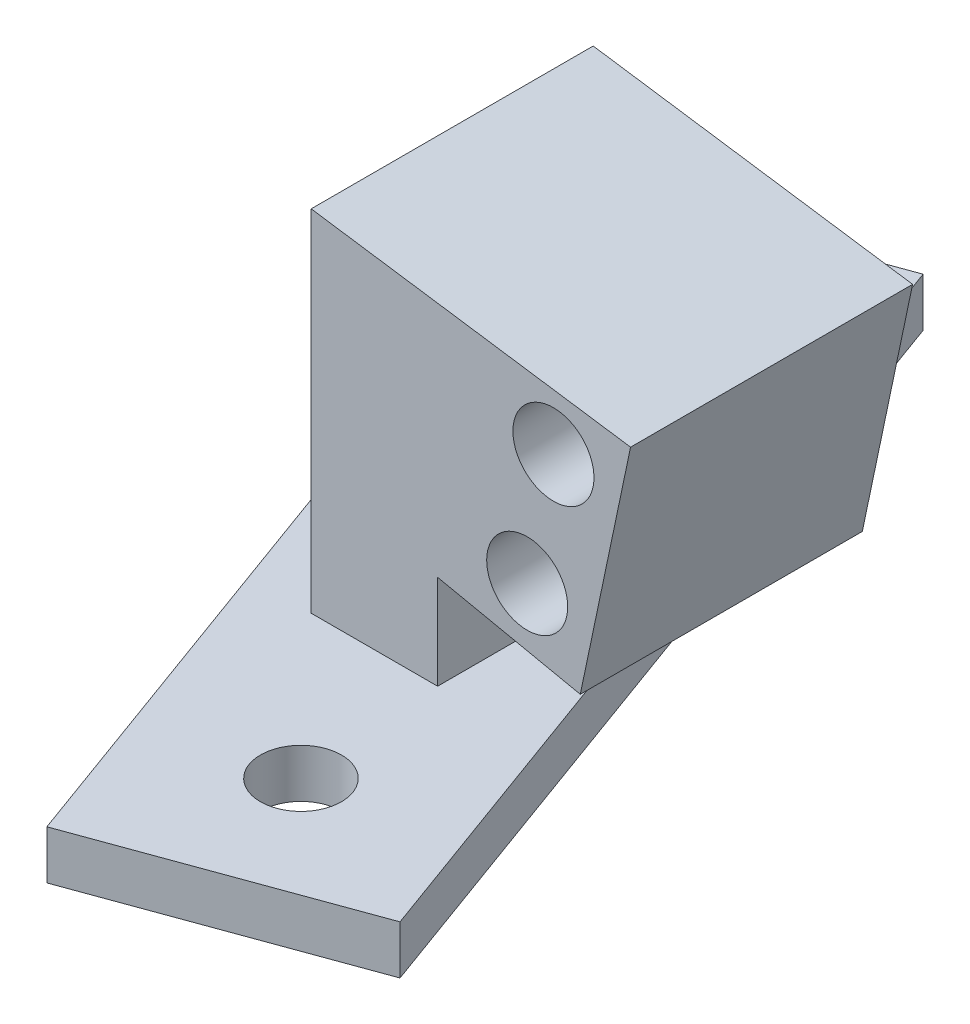
ISO-10303-21;
HEADER;
FILE_DESCRIPTION(('STEP AP214'),'2;1');
FILE_NAME('part.step','',(''),(''),'','','');
FILE_SCHEMA(('AUTOMOTIVE_DESIGN { 1 0 10303 214 1 1 1 1 }'));
ENDSEC;
DATA;
#1=APPLICATION_CONTEXT('core data for automotive mechanical design processes');
#2=APPLICATION_PROTOCOL_DEFINITION('international standard','automotive_design',2000,#1);
#3=PRODUCT_CONTEXT('',#1,'mechanical');
#4=PRODUCT('Part','Part','',(#3));
#5=PRODUCT_RELATED_PRODUCT_CATEGORY('part','',(#4));
#6=PRODUCT_DEFINITION_FORMATION('','',#4);
#7=PRODUCT_DEFINITION_CONTEXT('part definition',#1,'design');
#8=PRODUCT_DEFINITION('design','',#6,#7);
#9=PRODUCT_DEFINITION_SHAPE('','',#8);
#10=(LENGTH_UNIT() NAMED_UNIT(*) SI_UNIT(.MILLI.,.METRE.));
#11=(NAMED_UNIT(*) PLANE_ANGLE_UNIT() SI_UNIT($,.RADIAN.));
#12=(NAMED_UNIT(*) SI_UNIT($,.STERADIAN.) SOLID_ANGLE_UNIT());
#13=UNCERTAINTY_MEASURE_WITH_UNIT(LENGTH_MEASURE(1.E-05),#10,'distance_accuracy_value','');
#14=(GEOMETRIC_REPRESENTATION_CONTEXT(3) GLOBAL_UNCERTAINTY_ASSIGNED_CONTEXT((#13)) GLOBAL_UNIT_ASSIGNED_CONTEXT((#10,
#11,#12)) REPRESENTATION_CONTEXT('',''));
#15=CARTESIAN_POINT('',(0.,0.,0.));
#16=DIRECTION('',(0.,0.,1.));
#17=DIRECTION('',(1.,0.,0.));
#18=AXIS2_PLACEMENT_3D('',#15,#16,#17);
#19=CARTESIAN_POINT('',(-650.357758597395,213.432549690593,53.0414259923048));
#20=DIRECTION('',(0.205752852606501,0.978603987138969,0.));
#21=DIRECTION('',(-0.978603987138969,0.205752852606501,0.));
#22=AXIS2_PLACEMENT_3D('',#19,#20,#21);
#23=PLANE('',#22);
#24=DIRECTION('',(0.,0.,1.));
#25=VECTOR('',#24,1.);
#26=CARTESIAN_POINT('',(-644.129361835329,212.123020588114,0.));
#27=LINE('',#26,#25);
#28=CARTESIAN_POINT('',(-644.129361835329,212.123020588114,0.));
#29=VERTEX_POINT('',#28);
#30=CARTESIAN_POINT('',(-644.129361835329,212.123020588114,22.098));
#31=VERTEX_POINT('',#30);
#32=EDGE_CURVE('E126',#29,#31,#27,.T.);
#33=ORIENTED_EDGE('',*,*,#32,.F.);
#34=DIRECTION('',(0.978603987138969,-0.205752852606501,0.));
#35=VECTOR('',#34,1.);
#36=CARTESIAN_POINT('',(-650.357758597395,213.432549690593,0.));
#37=LINE('',#36,#35);
#38=CARTESIAN_POINT('',(-632.951817258193,209.772926257714,0.));
#39=VERTEX_POINT('',#38);
#40=EDGE_CURVE('E145',#29,#39,#37,.T.);
#41=ORIENTED_EDGE('',*,*,#40,.T.);
#42=DIRECTION('',(0.,0.,-1.));
#43=VECTOR('',#42,1.);
#44=CARTESIAN_POINT('',(-632.951817258193,209.772926257714,53.0414259923048));
#45=LINE('',#44,#43);
#46=CARTESIAN_POINT('',(-632.951817258193,209.772926257714,22.0979999999998));
#47=VERTEX_POINT('',#46);
#48=EDGE_CURVE('E143',#47,#39,#45,.T.);
#49=ORIENTED_EDGE('',*,*,#48,.F.);
#50=DIRECTION('',(-0.978603987138969,0.205752852606501,0.));
#51=VECTOR('',#50,1.);
#52=CARTESIAN_POINT('',(-650.357758597395,213.432549690593,22.0979999999998));
#53=LINE('',#52,#51);
#54=EDGE_CURVE('E70',#47,#31,#53,.T.);
#55=ORIENTED_EDGE('',*,*,#54,.T.);
#56=EDGE_LOOP('',(#33,#41,#49,#55));
#57=FACE_BOUND('',#56,.T.);
#58=ADVANCED_FACE('F45',(#57),#23,.F.);
#59=CARTESIAN_POINT('',(0.,0.,0.));
#60=DIRECTION('',(0.,0.,1.));
#61=DIRECTION('',(1.,0.,0.));
#62=AXIS2_PLACEMENT_3D('',#59,#60,#61);
#63=PLANE('',#62);
#64=DIRECTION('',(0.,1.,0.));
#65=VECTOR('',#64,1.);
#66=CARTESIAN_POINT('',(-654.037262265417,232.174381810683,0.));
#67=LINE('',#66,#65);
#68=CARTESIAN_POINT('',(-654.037262265417,204.732760244927,0.));
#69=VERTEX_POINT('',#68);
#70=CARTESIAN_POINT('',(-654.037262265417,232.174381810683,0.));
#71=VERTEX_POINT('',#70);
#72=EDGE_CURVE('E230',#69,#71,#67,.T.);
#73=ORIENTED_EDGE('',*,*,#72,.T.);
#74=DIRECTION('',(-0.989476406877661,0.144694299239717,0.));
#75=VECTOR('',#74,1.);
#76=CARTESIAN_POINT('',(-629.011320926215,228.514758377805,0.));
#77=LINE('',#76,#75);
#78=CARTESIAN_POINT('',(-629.011320926215,228.514758377805,0.));
#79=VERTEX_POINT('',#78);
#80=EDGE_CURVE('E251',#79,#71,#77,.T.);
#81=ORIENTED_EDGE('',*,*,#80,.F.);
#82=DIRECTION('',(0.205752852606502,0.978603987138969,0.));
#83=VECTOR('',#82,1.);
#84=CARTESIAN_POINT('',(-632.951817258193,209.772926257714,0.));
#85=LINE('',#84,#83);
#86=EDGE_CURVE('E151',#39,#79,#85,.T.);
#87=ORIENTED_EDGE('',*,*,#86,.F.);
#88=ORIENTED_EDGE('',*,*,#40,.F.);
#89=DIRECTION('',(0.,-1.,0.));
#90=VECTOR('',#89,1.);
#91=CARTESIAN_POINT('',(-644.129361835329,212.123020588114,0.));
#92=LINE('',#91,#90);
#93=CARTESIAN_POINT('',(-644.129361835329,204.732760244927,0.));
#94=VERTEX_POINT('',#93);
#95=EDGE_CURVE('E130',#29,#94,#92,.T.);
#96=ORIENTED_EDGE('',*,*,#95,.T.);
#97=DIRECTION('',(-1.,0.,0.));
#98=VECTOR('',#97,1.);
#99=CARTESIAN_POINT('',(-1.62308136655196E-13,204.732760244928,0.));
#100=LINE('',#99,#98);
#101=EDGE_CURVE('E61',#94,#69,#100,.T.);
#102=ORIENTED_EDGE('',*,*,#101,.T.);
#103=EDGE_LOOP('',(#73,#81,#87,#88,#96,#102));
#104=FACE_BOUND('',#103,.T.);
#105=CARTESIAN_POINT('',(-635.053635704384,224.999999999999,0.));
#106=DIRECTION('',(0.,0.,1.));
#107=DIRECTION('',(1.,0.,0.));
#108=AXIS2_PLACEMENT_3D('',#105,#106,#107);
#109=CIRCLE('',#108,3.1750000000002);
#110=CARTESIAN_POINT('',(-638.228635704384,224.999999999999,0.));
#111=VERTEX_POINT('',#110);
#112=EDGE_CURVE('E134',#111,#111,#109,.T.);
#113=ORIENTED_EDGE('',*,*,#112,.T.);
#114=EDGE_LOOP('',(#113));
#115=FACE_BOUND('',#114,.T.);
#116=CARTESIAN_POINT('',(-637.111164230449,215.21396012861,0.));
#117=DIRECTION('',(0.,0.,1.));
#118=DIRECTION('',(1.,0.,0.));
#119=AXIS2_PLACEMENT_3D('',#116,#117,#118);
#120=CIRCLE('',#119,3.17500000000009);
#121=CARTESIAN_POINT('',(-640.286164230449,215.21396012861,0.));
#122=VERTEX_POINT('',#121);
#123=EDGE_CURVE('E157',#122,#122,#120,.T.);
#124=ORIENTED_EDGE('',*,*,#123,.T.);
#125=EDGE_LOOP('',(#124));
#126=FACE_BOUND('',#125,.T.);
#127=ADVANCED_FACE('F258',(#104,#115,#126),#63,.F.);
#128=CARTESIAN_POINT('',(-632.951817258193,209.772926257714,53.0414259923048));
#129=DIRECTION('',(-0.978603987138969,0.205752852606502,0.));
#130=DIRECTION('',(-0.205752852606502,-0.978603987138969,0.));
#131=AXIS2_PLACEMENT_3D('',#128,#129,#130);
#132=PLANE('',#131);
#133=DIRECTION('',(0.,0.,-1.));
#134=VECTOR('',#133,1.);
#135=CARTESIAN_POINT('',(-629.011320926215,228.514758377805,53.0414259923048));
#136=LINE('',#135,#134);
#137=CARTESIAN_POINT('',(-629.011320926215,228.514758377805,22.0979999999998));
#138=VERTEX_POINT('',#137);
#139=EDGE_CURVE('E146',#138,#79,#136,.T.);
#140=ORIENTED_EDGE('',*,*,#139,.F.);
#141=DIRECTION('',(-0.205752852606502,-0.978603987138969,0.));
#142=VECTOR('',#141,1.);
#143=CARTESIAN_POINT('',(-632.951817258193,209.772926257714,22.0979999999998));
#144=LINE('',#143,#142);
#145=EDGE_CURVE('E154',#138,#47,#144,.T.);
#146=ORIENTED_EDGE('',*,*,#145,.T.);
#147=ORIENTED_EDGE('',*,*,#48,.T.);
#148=ORIENTED_EDGE('',*,*,#86,.T.);
#149=EDGE_LOOP('',(#140,#146,#147,#148));
#150=FACE_BOUND('',#149,.T.);
#151=ADVANCED_FACE('F273',(#150),#132,.F.);
#152=CARTESIAN_POINT('',(-635.053635704384,224.999999999999,53.0414259923048));
#153=DIRECTION('',(0.,0.,-1.));
#154=DIRECTION('',(-1.,0.,0.));
#155=AXIS2_PLACEMENT_3D('',#152,#153,#154);
#156=CYLINDRICAL_SURFACE('',#155,3.1750000000002);
#157=CARTESIAN_POINT('',(-635.053635704384,224.999999999999,22.0979999999998));
#158=DIRECTION('',(0.,0.,-1.));
#159=DIRECTION('',(-1.,0.,0.));
#160=AXIS2_PLACEMENT_3D('',#157,#158,#159);
#161=CIRCLE('',#160,3.1750000000002);
#162=CARTESIAN_POINT('',(-638.228635704384,224.999999999999,22.0979999999998));
#163=VERTEX_POINT('',#162);
#164=EDGE_CURVE('E11',#163,#163,#161,.T.);
#165=CARTESIAN_POINT('',(-638.228635704384,224.999999999999,22.0979999999998));
#166=CARTESIAN_POINT('',(-638.228635704384,224.999999999999,21.8678124999998));
#167=CARTESIAN_POINT('',(-638.228635704384,224.999999999999,21.6376249999998));
#168=CARTESIAN_POINT('',(-638.228635704384,224.999999999999,21.1772499999998));
#169=CARTESIAN_POINT('',(-638.228635704384,224.999999999999,20.9470624999998));
#170=CARTESIAN_POINT('',(-638.228635704384,224.999999999999,20.4866874999998));
#171=CARTESIAN_POINT('',(-638.228635704384,224.999999999999,20.2564999999998));
#172=CARTESIAN_POINT('',(-638.228635704384,224.999999999999,19.7961249999998));
#173=CARTESIAN_POINT('',(-638.228635704384,224.999999999999,19.5659374999998));
#174=CARTESIAN_POINT('',(-638.228635704384,224.999999999999,19.1055624999998));
#175=CARTESIAN_POINT('',(-638.228635704384,224.999999999999,18.8753749999998));
#176=CARTESIAN_POINT('',(-638.228635704384,224.999999999999,18.4149999999998));
#177=CARTESIAN_POINT('',(-638.228635704384,224.999999999999,18.1848124999998));
#178=CARTESIAN_POINT('',(-638.228635704384,224.999999999999,17.7244374999998));
#179=CARTESIAN_POINT('',(-638.228635704384,224.999999999999,17.4942499999998));
#180=CARTESIAN_POINT('',(-638.228635704384,224.999999999999,17.0338749999998));
#181=CARTESIAN_POINT('',(-638.228635704384,224.999999999999,16.8036874999998));
#182=CARTESIAN_POINT('',(-638.228635704384,224.999999999999,16.3433124999998));
#183=CARTESIAN_POINT('',(-638.228635704384,224.999999999999,16.1131249999998));
#184=CARTESIAN_POINT('',(-638.228635704384,224.999999999999,15.6527499999998));
#185=CARTESIAN_POINT('',(-638.228635704384,224.999999999999,15.4225624999998));
#186=CARTESIAN_POINT('',(-638.228635704384,224.999999999999,14.9621874999998));
#187=CARTESIAN_POINT('',(-638.228635704384,224.999999999999,14.7319999999998));
#188=CARTESIAN_POINT('',(-638.228635704384,224.999999999999,14.2716249999998));
#189=CARTESIAN_POINT('',(-638.228635704384,224.999999999999,14.0414374999998));
#190=CARTESIAN_POINT('',(-638.228635704384,224.999999999999,13.5810624999998));
#191=CARTESIAN_POINT('',(-638.228635704384,224.999999999999,13.3508749999999));
#192=CARTESIAN_POINT('',(-638.228635704384,224.999999999999,12.8904999999999));
#193=CARTESIAN_POINT('',(-638.228635704384,224.999999999999,12.6603124999999));
#194=CARTESIAN_POINT('',(-638.228635704384,224.999999999999,12.1999374999999));
#195=CARTESIAN_POINT('',(-638.228635704384,224.999999999999,11.9697499999999));
#196=CARTESIAN_POINT('',(-638.228635704384,224.999999999999,11.5093749999999));
#197=CARTESIAN_POINT('',(-638.228635704384,224.999999999999,11.2791874999999));
#198=CARTESIAN_POINT('',(-638.228635704384,224.999999999999,10.8188124999999));
#199=CARTESIAN_POINT('',(-638.228635704384,224.999999999999,10.5886249999999));
#200=CARTESIAN_POINT('',(-638.228635704384,224.999999999999,10.1282499999999));
#201=CARTESIAN_POINT('',(-638.228635704384,224.999999999999,9.89806249999989));
#202=CARTESIAN_POINT('',(-638.228635704384,224.999999999999,9.4376874999999));
#203=CARTESIAN_POINT('',(-638.228635704384,224.999999999999,9.2074999999999));
#204=CARTESIAN_POINT('',(-638.228635704384,224.999999999999,8.74712499999991));
#205=CARTESIAN_POINT('',(-638.228635704384,224.999999999999,8.51693749999991));
#206=CARTESIAN_POINT('',(-638.228635704384,224.999999999999,8.05656249999991));
#207=CARTESIAN_POINT('',(-638.228635704384,224.999999999999,7.82637499999992));
#208=CARTESIAN_POINT('',(-638.228635704384,224.999999999999,7.36599999999992));
#209=CARTESIAN_POINT('',(-638.228635704384,224.999999999999,7.13581249999992));
#210=CARTESIAN_POINT('',(-638.228635704384,224.999999999999,6.67543749999993));
#211=CARTESIAN_POINT('',(-638.228635704384,224.999999999999,6.44524999999993));
#212=CARTESIAN_POINT('',(-638.228635704384,224.999999999999,5.98487499999993));
#213=CARTESIAN_POINT('',(-638.228635704384,224.999999999999,5.75468749999994));
#214=CARTESIAN_POINT('',(-638.228635704384,224.999999999999,5.29431249999994));
#215=CARTESIAN_POINT('',(-638.228635704384,224.999999999999,5.06412499999994));
#216=CARTESIAN_POINT('',(-638.228635704384,224.999999999999,4.60374999999995));
#217=CARTESIAN_POINT('',(-638.228635704384,224.999999999999,4.37356249999995));
#218=CARTESIAN_POINT('',(-638.228635704384,224.999999999999,3.91318749999996));
#219=CARTESIAN_POINT('',(-638.228635704384,224.999999999999,3.68299999999996));
#220=CARTESIAN_POINT('',(-638.228635704384,224.999999999999,3.22262499999996));
#221=CARTESIAN_POINT('',(-638.228635704384,224.999999999999,2.99243749999996));
#222=CARTESIAN_POINT('',(-638.228635704384,224.999999999999,2.53206249999997));
#223=CARTESIAN_POINT('',(-638.228635704384,224.999999999999,2.30187499999997));
#224=CARTESIAN_POINT('',(-638.228635704384,224.999999999999,1.84149999999998));
#225=CARTESIAN_POINT('',(-638.228635704384,224.999999999999,1.61131249999998));
#226=CARTESIAN_POINT('',(-638.228635704384,224.999999999999,1.15093749999999));
#227=CARTESIAN_POINT('',(-638.228635704384,224.999999999999,0.920749999999989));
#228=CARTESIAN_POINT('',(-638.228635704384,224.999999999999,0.460374999999994));
#229=CARTESIAN_POINT('',(-638.228635704384,224.999999999999,0.230187499999997));
#230=CARTESIAN_POINT('',(-638.228635704384,224.999999999999,0.));
#231=B_SPLINE_CURVE_WITH_KNOTS('',3,(#165,#166,#167,#168,#169,#170,#171,#172,#173,#174,#175,
#176,#177,#178,#179,#180,#181,#182,#183,#184,#185,#186,#187,#188,#189,#190,#191,#192,#193,#194,
#195,#196,#197,#198,#199,#200,#201,#202,#203,#204,#205,#206,#207,#208,#209,#210,#211,#212,#213,
#214,#215,#216,#217,#218,#219,#220,#221,#222,#223,#224,#225,#226,#227,#228,#229,#230),
.UNSPECIFIED.,.F.,.F.,(4,2,2,2,2,2,2,2,2,2,2,2,2,2,2,2,2,2,2,2,2,2,2,2,2,2,2,2,2,2,2,2,4),(0.,
0.690562499999988,1.38112499999998,2.07168749999997,2.76224999999996,3.45281249999996,
4.14337499999995,4.83393749999994,5.52449999999994,6.21506249999993,6.90562499999992,
7.59618749999991,8.28674999999991,8.9773124999999,9.66787499999989,10.3584374999999,
11.0489999999999,11.7395624999999,12.4301249999999,13.1206874999998,13.8112499999998,
14.5018124999998,15.1923749999998,15.8829374999998,16.5734999999998,17.2640624999998,
17.9546249999998,18.6451874999998,19.3357499999998,20.0263124999998,20.7168749999998,
21.4074374999998,22.0979999999998),.UNSPECIFIED.);
#232=EDGE_CURVE('BSEAM275',#163,#111,#231,.T.);
#233=ORIENTED_EDGE('',*,*,#164,.F.);
#234=ORIENTED_EDGE('',*,*,#112,.F.);
#235=ORIENTED_EDGE('',*,*,#232,.T.);
#236=ORIENTED_EDGE('',*,*,#232,.F.);
#237=EDGE_LOOP('',(#233,#235,#234,#236));
#238=FACE_BOUND('',#237,.T.);
#239=ADVANCED_FACE('F275',(#238),#156,.F.);
#240=CARTESIAN_POINT('',(-637.111164230449,215.21396012861,53.0414259923048));
#241=DIRECTION('',(0.,0.,-1.));
#242=DIRECTION('',(-1.,0.,0.));
#243=AXIS2_PLACEMENT_3D('',#240,#241,#242);
#244=CYLINDRICAL_SURFACE('',#243,3.17500000000009);
#245=CARTESIAN_POINT('',(-637.111164230449,215.21396012861,22.0979999999998));
#246=DIRECTION('',(0.,0.,-1.));
#247=DIRECTION('',(-1.,0.,0.));
#248=AXIS2_PLACEMENT_3D('',#245,#246,#247);
#249=CIRCLE('',#248,3.17500000000009);
#250=CARTESIAN_POINT('',(-640.286164230449,215.21396012861,22.0979999999998));
#251=VERTEX_POINT('',#250);
#252=EDGE_CURVE('E49',#251,#251,#249,.T.);
#253=CARTESIAN_POINT('',(-640.286164230449,215.21396012861,22.0979999999998));
#254=CARTESIAN_POINT('',(-640.286164230449,215.21396012861,21.8678124999998));
#255=CARTESIAN_POINT('',(-640.286164230449,215.21396012861,21.6376249999998));
#256=CARTESIAN_POINT('',(-640.286164230449,215.21396012861,21.1772499999998));
#257=CARTESIAN_POINT('',(-640.286164230449,215.21396012861,20.9470624999998));
#258=CARTESIAN_POINT('',(-640.286164230449,215.21396012861,20.4866874999998));
#259=CARTESIAN_POINT('',(-640.286164230449,215.21396012861,20.2564999999998));
#260=CARTESIAN_POINT('',(-640.286164230449,215.21396012861,19.7961249999998));
#261=CARTESIAN_POINT('',(-640.286164230449,215.21396012861,19.5659374999998));
#262=CARTESIAN_POINT('',(-640.286164230449,215.21396012861,19.1055624999998));
#263=CARTESIAN_POINT('',(-640.286164230449,215.21396012861,18.8753749999998));
#264=CARTESIAN_POINT('',(-640.286164230449,215.21396012861,18.4149999999998));
#265=CARTESIAN_POINT('',(-640.286164230449,215.21396012861,18.1848124999998));
#266=CARTESIAN_POINT('',(-640.286164230449,215.21396012861,17.7244374999998));
#267=CARTESIAN_POINT('',(-640.286164230449,215.21396012861,17.4942499999998));
#268=CARTESIAN_POINT('',(-640.286164230449,215.21396012861,17.0338749999998));
#269=CARTESIAN_POINT('',(-640.286164230449,215.21396012861,16.8036874999998));
#270=CARTESIAN_POINT('',(-640.286164230449,215.21396012861,16.3433124999998));
#271=CARTESIAN_POINT('',(-640.286164230449,215.21396012861,16.1131249999998));
#272=CARTESIAN_POINT('',(-640.286164230449,215.21396012861,15.6527499999998));
#273=CARTESIAN_POINT('',(-640.286164230449,215.21396012861,15.4225624999998));
#274=CARTESIAN_POINT('',(-640.286164230449,215.21396012861,14.9621874999998));
#275=CARTESIAN_POINT('',(-640.286164230449,215.21396012861,14.7319999999998));
#276=CARTESIAN_POINT('',(-640.286164230449,215.21396012861,14.2716249999998));
#277=CARTESIAN_POINT('',(-640.286164230449,215.21396012861,14.0414374999998));
#278=CARTESIAN_POINT('',(-640.286164230449,215.21396012861,13.5810624999998));
#279=CARTESIAN_POINT('',(-640.286164230449,215.21396012861,13.3508749999999));
#280=CARTESIAN_POINT('',(-640.286164230449,215.21396012861,12.8904999999999));
#281=CARTESIAN_POINT('',(-640.286164230449,215.21396012861,12.6603124999999));
#282=CARTESIAN_POINT('',(-640.286164230449,215.21396012861,12.1999374999999));
#283=CARTESIAN_POINT('',(-640.286164230449,215.21396012861,11.9697499999999));
#284=CARTESIAN_POINT('',(-640.286164230449,215.21396012861,11.5093749999999));
#285=CARTESIAN_POINT('',(-640.286164230449,215.21396012861,11.2791874999999));
#286=CARTESIAN_POINT('',(-640.286164230449,215.21396012861,10.8188124999999));
#287=CARTESIAN_POINT('',(-640.286164230449,215.21396012861,10.5886249999999));
#288=CARTESIAN_POINT('',(-640.286164230449,215.21396012861,10.1282499999999));
#289=CARTESIAN_POINT('',(-640.286164230449,215.21396012861,9.89806249999989));
#290=CARTESIAN_POINT('',(-640.286164230449,215.21396012861,9.4376874999999));
#291=CARTESIAN_POINT('',(-640.286164230449,215.21396012861,9.2074999999999));
#292=CARTESIAN_POINT('',(-640.286164230449,215.21396012861,8.74712499999991));
#293=CARTESIAN_POINT('',(-640.286164230449,215.21396012861,8.51693749999991));
#294=CARTESIAN_POINT('',(-640.286164230449,215.21396012861,8.05656249999991));
#295=CARTESIAN_POINT('',(-640.286164230449,215.21396012861,7.82637499999992));
#296=CARTESIAN_POINT('',(-640.286164230449,215.21396012861,7.36599999999992));
#297=CARTESIAN_POINT('',(-640.286164230449,215.21396012861,7.13581249999992));
#298=CARTESIAN_POINT('',(-640.286164230449,215.21396012861,6.67543749999993));
#299=CARTESIAN_POINT('',(-640.286164230449,215.21396012861,6.44524999999993));
#300=CARTESIAN_POINT('',(-640.286164230449,215.21396012861,5.98487499999993));
#301=CARTESIAN_POINT('',(-640.286164230449,215.21396012861,5.75468749999994));
#302=CARTESIAN_POINT('',(-640.286164230449,215.21396012861,5.29431249999994));
#303=CARTESIAN_POINT('',(-640.286164230449,215.21396012861,5.06412499999994));
#304=CARTESIAN_POINT('',(-640.286164230449,215.21396012861,4.60374999999995));
#305=CARTESIAN_POINT('',(-640.286164230449,215.21396012861,4.37356249999995));
#306=CARTESIAN_POINT('',(-640.286164230449,215.21396012861,3.91318749999996));
#307=CARTESIAN_POINT('',(-640.286164230449,215.21396012861,3.68299999999996));
#308=CARTESIAN_POINT('',(-640.286164230449,215.21396012861,3.22262499999996));
#309=CARTESIAN_POINT('',(-640.286164230449,215.21396012861,2.99243749999996));
#310=CARTESIAN_POINT('',(-640.286164230449,215.21396012861,2.53206249999997));
#311=CARTESIAN_POINT('',(-640.286164230449,215.21396012861,2.30187499999997));
#312=CARTESIAN_POINT('',(-640.286164230449,215.21396012861,1.84149999999998));
#313=CARTESIAN_POINT('',(-640.286164230449,215.21396012861,1.61131249999998));
#314=CARTESIAN_POINT('',(-640.286164230449,215.21396012861,1.15093749999999));
#315=CARTESIAN_POINT('',(-640.286164230449,215.21396012861,0.920749999999989));
#316=CARTESIAN_POINT('',(-640.286164230449,215.21396012861,0.460374999999994));
#317=CARTESIAN_POINT('',(-640.286164230449,215.21396012861,0.230187499999997));
#318=CARTESIAN_POINT('',(-640.286164230449,215.21396012861,0.));
#319=B_SPLINE_CURVE_WITH_KNOTS('',3,(#253,#254,#255,#256,#257,#258,#259,#260,#261,#262,#263,
#264,#265,#266,#267,#268,#269,#270,#271,#272,#273,#274,#275,#276,#277,#278,#279,#280,#281,#282,
#283,#284,#285,#286,#287,#288,#289,#290,#291,#292,#293,#294,#295,#296,#297,#298,#299,#300,#301,
#302,#303,#304,#305,#306,#307,#308,#309,#310,#311,#312,#313,#314,#315,#316,#317,#318),
.UNSPECIFIED.,.F.,.F.,(4,2,2,2,2,2,2,2,2,2,2,2,2,2,2,2,2,2,2,2,2,2,2,2,2,2,2,2,2,2,2,2,4),(0.,
0.690562499999988,1.38112499999998,2.07168749999997,2.76224999999996,3.45281249999996,
4.14337499999995,4.83393749999994,5.52449999999994,6.21506249999993,6.90562499999992,
7.59618749999991,8.28674999999991,8.9773124999999,9.66787499999989,10.3584374999999,
11.0489999999999,11.7395624999999,12.4301249999999,13.1206874999998,13.8112499999998,
14.5018124999998,15.1923749999998,15.8829374999998,16.5734999999998,17.2640624999998,
17.9546249999998,18.6451874999998,19.3357499999998,20.0263124999998,20.7168749999998,
21.4074374999998,22.0979999999998),.UNSPECIFIED.);
#320=EDGE_CURVE('BSEAM282',#251,#122,#319,.T.);
#321=ORIENTED_EDGE('',*,*,#252,.F.);
#322=ORIENTED_EDGE('',*,*,#123,.F.);
#323=ORIENTED_EDGE('',*,*,#320,.T.);
#324=ORIENTED_EDGE('',*,*,#320,.F.);
#325=EDGE_LOOP('',(#321,#323,#322,#324));
#326=FACE_BOUND('',#325,.T.);
#327=ADVANCED_FACE('F282',(#326),#244,.F.);
#328=CARTESIAN_POINT('',(-602.012710946733,222.838262989788,22.0979999999998));
#329=DIRECTION('',(0.,0.,-1.));
#330=DIRECTION('',(-1.,0.,0.));
#331=AXIS2_PLACEMENT_3D('',#328,#329,#330);
#332=PLANE('',#331);
#333=ORIENTED_EDGE('',*,*,#252,.T.);
#334=EDGE_LOOP('',(#333));
#335=FACE_BOUND('',#334,.T.);
#336=ORIENTED_EDGE('',*,*,#164,.T.);
#337=EDGE_LOOP('',(#336));
#338=FACE_BOUND('',#337,.T.);
#339=ORIENTED_EDGE('',*,*,#145,.F.);
#340=DIRECTION('',(-0.989476406877661,0.144694299239717,0.));
#341=VECTOR('',#340,1.);
#342=CARTESIAN_POINT('',(-601.765252830471,224.530478709539,22.0979999999998));
#343=LINE('',#342,#341);
#344=CARTESIAN_POINT('',(-654.037262265417,232.174381810683,22.0979999999998));
#345=VERTEX_POINT('',#344);
#346=EDGE_CURVE('E244',#138,#345,#343,.T.);
#347=ORIENTED_EDGE('',*,*,#346,.T.);
#348=DIRECTION('',(0.,-1.,0.));
#349=VECTOR('',#348,1.);
#350=CARTESIAN_POINT('',(-654.037262265417,232.174381810683,22.0979999999998));
#351=LINE('',#350,#349);
#352=CARTESIAN_POINT('',(-654.037262265417,204.732760244927,22.0979999999998));
#353=VERTEX_POINT('',#352);
#354=EDGE_CURVE('E238',#345,#353,#351,.T.);
#355=ORIENTED_EDGE('',*,*,#354,.T.);
#356=DIRECTION('',(1.,0.,0.));
#357=VECTOR('',#356,1.);
#358=CARTESIAN_POINT('',(-602.012710946733,204.732760244927,22.0979999999998));
#359=LINE('',#358,#357);
#360=CARTESIAN_POINT('',(-644.129361835329,204.732760244927,22.098));
#361=VERTEX_POINT('',#360);
#362=EDGE_CURVE('E137',#353,#361,#359,.T.);
#363=ORIENTED_EDGE('',*,*,#362,.T.);
#364=DIRECTION('',(0.,-1.,0.));
#365=VECTOR('',#364,1.);
#366=CARTESIAN_POINT('',(-644.129361835329,212.123020588114,22.098));
#367=LINE('',#366,#365);
#368=EDGE_CURVE('E129',#31,#361,#367,.T.);
#369=ORIENTED_EDGE('',*,*,#368,.F.);
#370=ORIENTED_EDGE('',*,*,#54,.F.);
#371=EDGE_LOOP('',(#339,#347,#355,#363,#369,#370));
#372=FACE_BOUND('',#371,.T.);
#373=ADVANCED_FACE('F47',(#335,#338,#372),#332,.F.);
#374=CARTESIAN_POINT('',(-1.62308136655196E-13,204.732760244928,3.23605699491215E-13));
#375=DIRECTION('',(0.,1.,0.));
#376=DIRECTION('',(0.,0.,1.));
#377=AXIS2_PLACEMENT_3D('',#374,#375,#376);
#378=PLANE('',#377);
#379=DIRECTION('',(0.,0.,-1.));
#380=VECTOR('',#379,1.);
#381=CARTESIAN_POINT('',(-644.129361835329,204.732760244927,22.098));
#382=LINE('',#381,#380);
#383=EDGE_CURVE('E139',#361,#94,#382,.T.);
#384=ORIENTED_EDGE('',*,*,#383,.F.);
#385=ORIENTED_EDGE('',*,*,#362,.F.);
#386=DIRECTION('',(0.,0.,1.));
#387=VECTOR('',#386,1.);
#388=CARTESIAN_POINT('',(-654.037262265417,204.732760244927,-28.4799402063658));
#389=LINE('',#388,#387);
#390=EDGE_CURVE('E237',#69,#353,#389,.T.);
#391=ORIENTED_EDGE('',*,*,#390,.F.);
#392=ORIENTED_EDGE('',*,*,#101,.F.);
#393=EDGE_LOOP('',(#384,#385,#391,#392));
#394=FACE_BOUND('',#393,.T.);
#395=DIRECTION('',(-0.939692620785907,0.,0.342020143325672));
#396=VECTOR('',#395,1.);
#397=CARTESIAN_POINT('',(-653.068781287116,204.732760244927,-24.8837239782171));
#398=LINE('',#397,#396);
#399=CARTESIAN_POINT('',(-653.068781287116,204.732760244927,-24.8837239782171));
#400=VERTEX_POINT('',#399);
#401=CARTESIAN_POINT('',(-673.356744969884,204.732760244927,-17.4995090838158));
#402=VERTEX_POINT('',#401);
#403=EDGE_CURVE('E199',#400,#402,#398,.T.);
#404=ORIENTED_EDGE('',*,*,#403,.T.);
#405=DIRECTION('',(0.342020143325673,0.,0.939692620785907));
#406=VECTOR('',#405,1.);
#407=CARTESIAN_POINT('',(-673.356744969884,204.732760244927,-17.4995090838158));
#408=LINE('',#407,#406);
#409=CARTESIAN_POINT('',(-649.901003540609,204.732760244927,46.9446108496817));
#410=VERTEX_POINT('',#409);
#411=EDGE_CURVE('E195',#402,#410,#408,.T.);
#412=ORIENTED_EDGE('',*,*,#411,.T.);
#413=DIRECTION('',(0.939692620785907,0.,-0.342020143325672));
#414=VECTOR('',#413,1.);
#415=CARTESIAN_POINT('',(-649.901003540609,204.732760244927,46.9446108496817));
#416=LINE('',#415,#414);
#417=CARTESIAN_POINT('',(-629.613039857842,204.732760244927,39.5603959552804));
#418=VERTEX_POINT('',#417);
#419=EDGE_CURVE('E191',#410,#418,#416,.T.);
#420=ORIENTED_EDGE('',*,*,#419,.T.);
#421=DIRECTION('',(-0.342020143325673,0.,-0.939692620785907));
#422=VECTOR('',#421,1.);
#423=CARTESIAN_POINT('',(-629.613039857842,204.732760244927,39.5603959552804));
#424=LINE('',#423,#422);
#425=EDGE_CURVE('E186',#418,#400,#424,.T.);
#426=ORIENTED_EDGE('',*,*,#425,.T.);
#427=EDGE_LOOP('',(#404,#412,#420,#426));
#428=FACE_BOUND('',#427,.T.);
#429=CARTESIAN_POINT('',(-659.737838472311,204.732760244927,-11.6443395038316));
#430=DIRECTION('',(0.,1.,0.));
#431=DIRECTION('',(0.,0.,1.));
#432=AXIS2_PLACEMENT_3D('',#429,#430,#431);
#433=CIRCLE('',#432,3.17499999999997);
#434=CARTESIAN_POINT('',(-659.737838472311,204.732760244927,-8.46933950383166));
#435=VERTEX_POINT('',#434);
#436=EDGE_CURVE('E218',#435,#435,#433,.T.);
#437=ORIENTED_EDGE('',*,*,#436,.F.);
#438=EDGE_LOOP('',(#437));
#439=FACE_BOUND('',#438,.T.);
#440=CARTESIAN_POINT('',(-643.231946355414,204.732760244927,33.7052263752962));
#441=DIRECTION('',(0.,1.,0.));
#442=DIRECTION('',(0.,0.,1.));
#443=AXIS2_PLACEMENT_3D('',#440,#441,#442);
#444=CIRCLE('',#443,3.17500000000008);
#445=CARTESIAN_POINT('',(-643.231946355414,204.732760244927,36.8802263752963));
#446=VERTEX_POINT('',#445);
#447=EDGE_CURVE('E226',#446,#446,#444,.T.);
#448=ORIENTED_EDGE('',*,*,#447,.F.);
#449=EDGE_LOOP('',(#448));
#450=FACE_BOUND('',#449,.T.);
#451=ADVANCED_FACE('F262',(#394,#428,#439,#450),#378,.T.);
#452=CARTESIAN_POINT('',(-653.068781287116,200.922760244927,-24.8837239782171));
#453=DIRECTION('',(-0.342020143325672,0.,-0.939692620785907));
#454=DIRECTION('',(-0.939692620785907,0.,0.342020143325672));
#455=AXIS2_PLACEMENT_3D('',#452,#453,#454);
#456=PLANE('',#455);
#457=ORIENTED_EDGE('',*,*,#403,.F.);
#458=DIRECTION('',(0.,1.,0.));
#459=VECTOR('',#458,1.);
#460=CARTESIAN_POINT('',(-653.068781287116,200.922760244927,-24.8837239782171));
#461=LINE('',#460,#459);
#462=CARTESIAN_POINT('',(-653.068781287116,200.922760244927,-24.8837239782171));
#463=VERTEX_POINT('',#462);
#464=EDGE_CURVE('E173',#463,#400,#461,.T.);
#465=ORIENTED_EDGE('',*,*,#464,.F.);
#466=DIRECTION('',(-0.939692620785907,0.,0.342020143325672));
#467=VECTOR('',#466,1.);
#468=CARTESIAN_POINT('',(-653.068781287116,200.922760244927,-24.8837239782171));
#469=LINE('',#468,#467);
#470=CARTESIAN_POINT('',(-673.356744969884,200.922760244927,-17.4995090838158));
#471=VERTEX_POINT('',#470);
#472=EDGE_CURVE('E190',#463,#471,#469,.T.);
#473=ORIENTED_EDGE('',*,*,#472,.T.);
#474=DIRECTION('',(0.,1.,0.));
#475=VECTOR('',#474,1.);
#476=CARTESIAN_POINT('',(-673.356744969884,200.922760244927,-17.4995090838158));
#477=LINE('',#476,#475);
#478=EDGE_CURVE('E174',#471,#402,#477,.T.);
#479=ORIENTED_EDGE('',*,*,#478,.T.);
#480=EDGE_LOOP('',(#457,#465,#473,#479));
#481=FACE_BOUND('',#480,.T.);
#482=ADVANCED_FACE('F293',(#481),#456,.T.);
#483=CARTESIAN_POINT('',(-629.613039857842,200.922760244927,39.5603959552804));
#484=DIRECTION('',(0.939692620785907,0.,-0.342020143325673));
#485=DIRECTION('',(-0.342020143325673,0.,-0.939692620785907));
#486=AXIS2_PLACEMENT_3D('',#483,#484,#485);
#487=PLANE('',#486);
#488=ORIENTED_EDGE('',*,*,#425,.F.);
#489=DIRECTION('',(0.,1.,0.));
#490=VECTOR('',#489,1.);
#491=CARTESIAN_POINT('',(-629.613039857842,200.922760244927,39.5603959552804));
#492=LINE('',#491,#490);
#493=CARTESIAN_POINT('',(-629.613039857842,200.922760244927,39.5603959552804));
#494=VERTEX_POINT('',#493);
#495=EDGE_CURVE('E181',#494,#418,#492,.T.);
#496=ORIENTED_EDGE('',*,*,#495,.F.);
#497=DIRECTION('',(-0.342020143325673,0.,-0.939692620785907));
#498=VECTOR('',#497,1.);
#499=CARTESIAN_POINT('',(-629.613039857842,200.922760244927,39.5603959552804));
#500=LINE('',#499,#498);
#501=EDGE_CURVE('E178',#494,#463,#500,.T.);
#502=ORIENTED_EDGE('',*,*,#501,.T.);
#503=ORIENTED_EDGE('',*,*,#464,.T.);
#504=EDGE_LOOP('',(#488,#496,#502,#503));
#505=FACE_BOUND('',#504,.T.);
#506=ADVANCED_FACE('F296',(#505),#487,.T.);
#507=CARTESIAN_POINT('',(-649.901003540609,200.922760244927,46.9446108496817));
#508=DIRECTION('',(0.342020143325672,0.,0.939692620785907));
#509=DIRECTION('',(0.939692620785907,0.,-0.342020143325672));
#510=AXIS2_PLACEMENT_3D('',#507,#508,#509);
#511=PLANE('',#510);
#512=ORIENTED_EDGE('',*,*,#419,.F.);
#513=DIRECTION('',(0.,1.,0.));
#514=VECTOR('',#513,1.);
#515=CARTESIAN_POINT('',(-649.901003540609,200.922760244927,46.9446108496817));
#516=LINE('',#515,#514);
#517=CARTESIAN_POINT('',(-649.901003540609,200.922760244927,46.9446108496817));
#518=VERTEX_POINT('',#517);
#519=EDGE_CURVE('E177',#518,#410,#516,.T.);
#520=ORIENTED_EDGE('',*,*,#519,.F.);
#521=DIRECTION('',(0.939692620785907,0.,-0.342020143325672));
#522=VECTOR('',#521,1.);
#523=CARTESIAN_POINT('',(-649.901003540609,200.922760244927,46.9446108496817));
#524=LINE('',#523,#522);
#525=EDGE_CURVE('E207',#518,#494,#524,.T.);
#526=ORIENTED_EDGE('',*,*,#525,.T.);
#527=ORIENTED_EDGE('',*,*,#495,.T.);
#528=EDGE_LOOP('',(#512,#520,#526,#527));
#529=FACE_BOUND('',#528,.T.);
#530=ADVANCED_FACE('F302',(#529),#511,.T.);
#531=CARTESIAN_POINT('',(-673.356744969884,200.922760244927,-17.4995090838158));
#532=DIRECTION('',(-0.939692620785907,0.,0.342020143325673));
#533=DIRECTION('',(0.342020143325673,0.,0.939692620785907));
#534=AXIS2_PLACEMENT_3D('',#531,#532,#533);
#535=PLANE('',#534);
#536=ORIENTED_EDGE('',*,*,#411,.F.);
#537=ORIENTED_EDGE('',*,*,#478,.F.);
#538=DIRECTION('',(0.342020143325673,0.,0.939692620785907));
#539=VECTOR('',#538,1.);
#540=CARTESIAN_POINT('',(-673.356744969884,200.922760244927,-17.4995090838158));
#541=LINE('',#540,#539);
#542=EDGE_CURVE('E211',#471,#518,#541,.T.);
#543=ORIENTED_EDGE('',*,*,#542,.T.);
#544=ORIENTED_EDGE('',*,*,#519,.T.);
#545=EDGE_LOOP('',(#536,#537,#543,#544));
#546=FACE_BOUND('',#545,.T.);
#547=ADVANCED_FACE('F298',(#546),#535,.T.);
#548=CARTESIAN_POINT('',(-1.57401537012738E-13,200.922760244928,3.17839648768501E-13));
#549=DIRECTION('',(0.,1.,0.));
#550=DIRECTION('',(0.,0.,1.));
#551=AXIS2_PLACEMENT_3D('',#548,#549,#550);
#552=PLANE('',#551);
#553=CARTESIAN_POINT('',(-643.231946355414,200.922760244927,33.7052263752962));
#554=DIRECTION('',(0.,1.,0.));
#555=DIRECTION('',(0.,0.,1.));
#556=AXIS2_PLACEMENT_3D('',#553,#554,#555);
#557=CIRCLE('',#556,3.17500000000008);
#558=CARTESIAN_POINT('',(-643.231946355414,200.922760244927,36.8802263752963));
#559=VERTEX_POINT('',#558);
#560=EDGE_CURVE('E222',#559,#559,#557,.T.);
#561=ORIENTED_EDGE('',*,*,#560,.T.);
#562=EDGE_LOOP('',(#561));
#563=FACE_BOUND('',#562,.T.);
#564=CARTESIAN_POINT('',(-659.737838472311,200.922760244927,-11.6443395038316));
#565=DIRECTION('',(0.,1.,0.));
#566=DIRECTION('',(0.,0.,1.));
#567=AXIS2_PLACEMENT_3D('',#564,#565,#566);
#568=CIRCLE('',#567,3.17499999999997);
#569=CARTESIAN_POINT('',(-659.737838472311,200.922760244927,-8.46933950383167));
#570=VERTEX_POINT('',#569);
#571=EDGE_CURVE('E203',#570,#570,#568,.T.);
#572=ORIENTED_EDGE('',*,*,#571,.T.);
#573=EDGE_LOOP('',(#572));
#574=FACE_BOUND('',#573,.T.);
#575=ORIENTED_EDGE('',*,*,#472,.F.);
#576=ORIENTED_EDGE('',*,*,#501,.F.);
#577=ORIENTED_EDGE('',*,*,#525,.F.);
#578=ORIENTED_EDGE('',*,*,#542,.F.);
#579=EDGE_LOOP('',(#575,#576,#577,#578));
#580=FACE_BOUND('',#579,.T.);
#581=ADVANCED_FACE('F301',(#563,#574,#580),#552,.F.);
#582=CARTESIAN_POINT('',(-659.737838472311,200.922760244927,-11.6443395038316));
#583=DIRECTION('',(0.,1.,0.));
#584=DIRECTION('',(0.,0.,1.));
#585=AXIS2_PLACEMENT_3D('',#582,#583,#584);
#586=CYLINDRICAL_SURFACE('',#585,3.17499999999997);
#587=CARTESIAN_POINT('',(-659.737838472311,200.922760244927,-8.46933950383167));
#588=CARTESIAN_POINT('',(-659.737838472311,200.962447744927,-8.46933950383167));
#589=CARTESIAN_POINT('',(-659.737838472311,201.002135244927,-8.46933950383167));
#590=CARTESIAN_POINT('',(-659.737838472311,201.081510244927,-8.46933950383167));
#591=CARTESIAN_POINT('',(-659.737838472311,201.121197744927,-8.46933950383167));
#592=CARTESIAN_POINT('',(-659.737838472311,201.200572744927,-8.46933950383167));
#593=CARTESIAN_POINT('',(-659.737838472311,201.240260244927,-8.46933950383167));
#594=CARTESIAN_POINT('',(-659.737838472311,201.319635244927,-8.46933950383167));
#595=CARTESIAN_POINT('',(-659.737838472311,201.359322744927,-8.46933950383167));
#596=CARTESIAN_POINT('',(-659.737838472311,201.438697744927,-8.46933950383167));
#597=CARTESIAN_POINT('',(-659.737838472311,201.478385244927,-8.46933950383166));
#598=CARTESIAN_POINT('',(-659.737838472311,201.557760244927,-8.46933950383166));
#599=CARTESIAN_POINT('',(-659.737838472311,201.597447744927,-8.46933950383166));
#600=CARTESIAN_POINT('',(-659.737838472311,201.676822744927,-8.46933950383166));
#601=CARTESIAN_POINT('',(-659.737838472311,201.716510244927,-8.46933950383166));
#602=CARTESIAN_POINT('',(-659.737838472311,201.795885244927,-8.46933950383166));
#603=CARTESIAN_POINT('',(-659.737838472311,201.835572744927,-8.46933950383166));
#604=CARTESIAN_POINT('',(-659.737838472311,201.914947744927,-8.46933950383166));
#605=CARTESIAN_POINT('',(-659.737838472311,201.954635244927,-8.46933950383166));
#606=CARTESIAN_POINT('',(-659.737838472311,202.034010244927,-8.46933950383166));
#607=CARTESIAN_POINT('',(-659.737838472311,202.073697744927,-8.46933950383166));
#608=CARTESIAN_POINT('',(-659.737838472311,202.153072744927,-8.46933950383166));
#609=CARTESIAN_POINT('',(-659.737838472311,202.192760244927,-8.46933950383166));
#610=CARTESIAN_POINT('',(-659.737838472311,202.272135244927,-8.46933950383166));
#611=CARTESIAN_POINT('',(-659.737838472311,202.311822744927,-8.46933950383166));
#612=CARTESIAN_POINT('',(-659.737838472311,202.391197744927,-8.46933950383166));
#613=CARTESIAN_POINT('',(-659.737838472311,202.430885244927,-8.46933950383166));
#614=CARTESIAN_POINT('',(-659.737838472311,202.510260244927,-8.46933950383166));
#615=CARTESIAN_POINT('',(-659.737838472311,202.549947744927,-8.46933950383166));
#616=CARTESIAN_POINT('',(-659.737838472311,202.629322744927,-8.46933950383166));
#617=CARTESIAN_POINT('',(-659.737838472311,202.669010244927,-8.46933950383166));
#618=CARTESIAN_POINT('',(-659.737838472311,202.748385244927,-8.46933950383166));
#619=CARTESIAN_POINT('',(-659.737838472311,202.788072744927,-8.46933950383166));
#620=CARTESIAN_POINT('',(-659.737838472311,202.867447744927,-8.46933950383166));
#621=CARTESIAN_POINT('',(-659.737838472311,202.907135244927,-8.46933950383166));
#622=CARTESIAN_POINT('',(-659.737838472311,202.986510244927,-8.46933950383166));
#623=CARTESIAN_POINT('',(-659.737838472311,203.026197744927,-8.46933950383166));
#624=CARTESIAN_POINT('',(-659.737838472311,203.105572744927,-8.46933950383166));
#625=CARTESIAN_POINT('',(-659.737838472311,203.145260244927,-8.46933950383166));
#626=CARTESIAN_POINT('',(-659.737838472311,203.224635244927,-8.46933950383166));
#627=CARTESIAN_POINT('',(-659.737838472311,203.264322744927,-8.46933950383166));
#628=CARTESIAN_POINT('',(-659.737838472311,203.343697744927,-8.46933950383166));
#629=CARTESIAN_POINT('',(-659.737838472311,203.383385244927,-8.46933950383166));
#630=CARTESIAN_POINT('',(-659.737838472311,203.462760244927,-8.46933950383166));
#631=CARTESIAN_POINT('',(-659.737838472311,203.502447744927,-8.46933950383166));
#632=CARTESIAN_POINT('',(-659.737838472311,203.581822744927,-8.46933950383166));
#633=CARTESIAN_POINT('',(-659.737838472311,203.621510244927,-8.46933950383166));
#634=CARTESIAN_POINT('',(-659.737838472311,203.700885244927,-8.46933950383166));
#635=CARTESIAN_POINT('',(-659.737838472311,203.740572744927,-8.46933950383166));
#636=CARTESIAN_POINT('',(-659.737838472311,203.819947744927,-8.46933950383166));
#637=CARTESIAN_POINT('',(-659.737838472311,203.859635244927,-8.46933950383166));
#638=CARTESIAN_POINT('',(-659.737838472311,203.939010244927,-8.46933950383166));
#639=CARTESIAN_POINT('',(-659.737838472311,203.978697744927,-8.46933950383166));
#640=CARTESIAN_POINT('',(-659.737838472311,204.058072744927,-8.46933950383166));
#641=CARTESIAN_POINT('',(-659.737838472311,204.097760244927,-8.46933950383166));
#642=CARTESIAN_POINT('',(-659.737838472311,204.177135244927,-8.46933950383166));
#643=CARTESIAN_POINT('',(-659.737838472311,204.216822744927,-8.46933950383166));
#644=CARTESIAN_POINT('',(-659.737838472311,204.296197744927,-8.46933950383166));
#645=CARTESIAN_POINT('',(-659.737838472311,204.335885244927,-8.46933950383166));
#646=CARTESIAN_POINT('',(-659.737838472311,204.415260244927,-8.46933950383166));
#647=CARTESIAN_POINT('',(-659.737838472311,204.454947744927,-8.46933950383166));
#648=CARTESIAN_POINT('',(-659.737838472311,204.534322744927,-8.46933950383166));
#649=CARTESIAN_POINT('',(-659.737838472311,204.574010244927,-8.46933950383166));
#650=CARTESIAN_POINT('',(-659.737838472311,204.653385244927,-8.46933950383166));
#651=CARTESIAN_POINT('',(-659.737838472311,204.693072744927,-8.46933950383166));
#652=CARTESIAN_POINT('',(-659.737838472311,204.732760244927,-8.46933950383166));
#653=B_SPLINE_CURVE_WITH_KNOTS('',3,(#587,#588,#589,#590,#591,#592,#593,#594,#595,#596,#597,
#598,#599,#600,#601,#602,#603,#604,#605,#606,#607,#608,#609,#610,#611,#612,#613,#614,#615,#616,
#617,#618,#619,#620,#621,#622,#623,#624,#625,#626,#627,#628,#629,#630,#631,#632,#633,#634,#635,
#636,#637,#638,#639,#640,#641,#642,#643,#644,#645,#646,#647,#648,#649,#650,#651,#652),
.UNSPECIFIED.,.F.,.F.,(4,2,2,2,2,2,2,2,2,2,2,2,2,2,2,2,2,2,2,2,2,2,2,2,2,2,2,2,2,2,2,2,4),(0.,
0.119062500000017,0.238125000000006,0.357187500000022,0.476250000000011,0.595312500000028,
0.714375000000017,0.833437500000006,0.952500000000023,1.07156250000001,1.19062500000003,
1.30968750000002,1.42875000000001,1.54781250000002,1.66687500000001,1.78593750000003,
1.90500000000002,2.02406250000001,2.14312500000002,2.26218750000001,2.38125000000003,
2.50031250000002,2.61937500000001,2.73843750000002,2.85750000000001,2.97656250000003,
3.09562500000002,3.21468750000001,3.33375000000002,3.45281250000001,3.57187500000003,
3.69093750000002,3.81000000000001),.UNSPECIFIED.);
#654=EDGE_CURVE('BSEAM314',#570,#435,#653,.T.);
#655=ORIENTED_EDGE('',*,*,#571,.F.);
#656=ORIENTED_EDGE('',*,*,#436,.T.);
#657=ORIENTED_EDGE('',*,*,#654,.T.);
#658=ORIENTED_EDGE('',*,*,#654,.F.);
#659=EDGE_LOOP('',(#655,#657,#656,#658));
#660=FACE_BOUND('',#659,.T.);
#661=ADVANCED_FACE('F314',(#660),#586,.F.);
#662=CARTESIAN_POINT('',(-643.231946355414,200.922760244927,33.7052263752962));
#663=DIRECTION('',(0.,1.,0.));
#664=DIRECTION('',(0.,0.,1.));
#665=AXIS2_PLACEMENT_3D('',#662,#663,#664);
#666=CYLINDRICAL_SURFACE('',#665,3.17500000000008);
#667=CARTESIAN_POINT('',(-643.231946355414,200.922760244927,36.8802263752963));
#668=CARTESIAN_POINT('',(-643.231946355414,200.962447744927,36.8802263752963));
#669=CARTESIAN_POINT('',(-643.231946355414,201.002135244927,36.8802263752963));
#670=CARTESIAN_POINT('',(-643.231946355414,201.081510244927,36.8802263752963));
#671=CARTESIAN_POINT('',(-643.231946355414,201.121197744927,36.8802263752963));
#672=CARTESIAN_POINT('',(-643.231946355414,201.200572744927,36.8802263752963));
#673=CARTESIAN_POINT('',(-643.231946355414,201.240260244927,36.8802263752963));
#674=CARTESIAN_POINT('',(-643.231946355414,201.319635244927,36.8802263752963));
#675=CARTESIAN_POINT('',(-643.231946355414,201.359322744927,36.8802263752963));
#676=CARTESIAN_POINT('',(-643.231946355414,201.438697744927,36.8802263752963));
#677=CARTESIAN_POINT('',(-643.231946355414,201.478385244927,36.8802263752963));
#678=CARTESIAN_POINT('',(-643.231946355414,201.557760244927,36.8802263752963));
#679=CARTESIAN_POINT('',(-643.231946355414,201.597447744927,36.8802263752963));
#680=CARTESIAN_POINT('',(-643.231946355414,201.676822744927,36.8802263752963));
#681=CARTESIAN_POINT('',(-643.231946355414,201.716510244927,36.8802263752963));
#682=CARTESIAN_POINT('',(-643.231946355414,201.795885244927,36.8802263752963));
#683=CARTESIAN_POINT('',(-643.231946355414,201.835572744927,36.8802263752963));
#684=CARTESIAN_POINT('',(-643.231946355414,201.914947744927,36.8802263752963));
#685=CARTESIAN_POINT('',(-643.231946355414,201.954635244927,36.8802263752963));
#686=CARTESIAN_POINT('',(-643.231946355414,202.034010244927,36.8802263752963));
#687=CARTESIAN_POINT('',(-643.231946355414,202.073697744927,36.8802263752963));
#688=CARTESIAN_POINT('',(-643.231946355414,202.153072744927,36.8802263752963));
#689=CARTESIAN_POINT('',(-643.231946355414,202.192760244927,36.8802263752963));
#690=CARTESIAN_POINT('',(-643.231946355414,202.272135244927,36.8802263752963));
#691=CARTESIAN_POINT('',(-643.231946355414,202.311822744927,36.8802263752963));
#692=CARTESIAN_POINT('',(-643.231946355414,202.391197744927,36.8802263752963));
#693=CARTESIAN_POINT('',(-643.231946355414,202.430885244927,36.8802263752963));
#694=CARTESIAN_POINT('',(-643.231946355414,202.510260244927,36.8802263752963));
#695=CARTESIAN_POINT('',(-643.231946355414,202.549947744927,36.8802263752963));
#696=CARTESIAN_POINT('',(-643.231946355414,202.629322744927,36.8802263752963));
#697=CARTESIAN_POINT('',(-643.231946355414,202.669010244927,36.8802263752963));
#698=CARTESIAN_POINT('',(-643.231946355414,202.748385244927,36.8802263752963));
#699=CARTESIAN_POINT('',(-643.231946355414,202.788072744927,36.8802263752963));
#700=CARTESIAN_POINT('',(-643.231946355414,202.867447744927,36.8802263752963));
#701=CARTESIAN_POINT('',(-643.231946355414,202.907135244927,36.8802263752963));
#702=CARTESIAN_POINT('',(-643.231946355414,202.986510244927,36.8802263752963));
#703=CARTESIAN_POINT('',(-643.231946355414,203.026197744927,36.8802263752963));
#704=CARTESIAN_POINT('',(-643.231946355414,203.105572744927,36.8802263752963));
#705=CARTESIAN_POINT('',(-643.231946355414,203.145260244927,36.8802263752963));
#706=CARTESIAN_POINT('',(-643.231946355414,203.224635244927,36.8802263752963));
#707=CARTESIAN_POINT('',(-643.231946355414,203.264322744927,36.8802263752963));
#708=CARTESIAN_POINT('',(-643.231946355414,203.343697744927,36.8802263752963));
#709=CARTESIAN_POINT('',(-643.231946355414,203.383385244927,36.8802263752963));
#710=CARTESIAN_POINT('',(-643.231946355414,203.462760244927,36.8802263752963));
#711=CARTESIAN_POINT('',(-643.231946355414,203.502447744927,36.8802263752963));
#712=CARTESIAN_POINT('',(-643.231946355414,203.581822744927,36.8802263752963));
#713=CARTESIAN_POINT('',(-643.231946355414,203.621510244927,36.8802263752963));
#714=CARTESIAN_POINT('',(-643.231946355414,203.700885244927,36.8802263752963));
#715=CARTESIAN_POINT('',(-643.231946355414,203.740572744927,36.8802263752963));
#716=CARTESIAN_POINT('',(-643.231946355414,203.819947744927,36.8802263752963));
#717=CARTESIAN_POINT('',(-643.231946355414,203.859635244927,36.8802263752963));
#718=CARTESIAN_POINT('',(-643.231946355414,203.939010244927,36.8802263752963));
#719=CARTESIAN_POINT('',(-643.231946355414,203.978697744927,36.8802263752963));
#720=CARTESIAN_POINT('',(-643.231946355414,204.058072744927,36.8802263752963));
#721=CARTESIAN_POINT('',(-643.231946355414,204.097760244927,36.8802263752963));
#722=CARTESIAN_POINT('',(-643.231946355414,204.177135244927,36.8802263752963));
#723=CARTESIAN_POINT('',(-643.231946355414,204.216822744927,36.8802263752963));
#724=CARTESIAN_POINT('',(-643.231946355414,204.296197744927,36.8802263752963));
#725=CARTESIAN_POINT('',(-643.231946355414,204.335885244927,36.8802263752963));
#726=CARTESIAN_POINT('',(-643.231946355414,204.415260244927,36.8802263752963));
#727=CARTESIAN_POINT('',(-643.231946355414,204.454947744927,36.8802263752963));
#728=CARTESIAN_POINT('',(-643.231946355414,204.534322744927,36.8802263752963));
#729=CARTESIAN_POINT('',(-643.231946355414,204.574010244927,36.8802263752963));
#730=CARTESIAN_POINT('',(-643.231946355414,204.653385244927,36.8802263752963));
#731=CARTESIAN_POINT('',(-643.231946355414,204.693072744927,36.8802263752963));
#732=CARTESIAN_POINT('',(-643.231946355414,204.732760244927,36.8802263752963));
#733=B_SPLINE_CURVE_WITH_KNOTS('',3,(#667,#668,#669,#670,#671,#672,#673,#674,#675,#676,#677,
#678,#679,#680,#681,#682,#683,#684,#685,#686,#687,#688,#689,#690,#691,#692,#693,#694,#695,#696,
#697,#698,#699,#700,#701,#702,#703,#704,#705,#706,#707,#708,#709,#710,#711,#712,#713,#714,#715,
#716,#717,#718,#719,#720,#721,#722,#723,#724,#725,#726,#727,#728,#729,#730,#731,#732),
.UNSPECIFIED.,.F.,.F.,(4,2,2,2,2,2,2,2,2,2,2,2,2,2,2,2,2,2,2,2,2,2,2,2,2,2,2,2,2,2,2,2,4),(0.,
0.119062500000017,0.238125000000006,0.357187500000022,0.476250000000011,0.595312500000028,
0.714375000000017,0.833437500000006,0.952500000000023,1.07156250000001,1.19062500000003,
1.30968750000002,1.42875000000001,1.54781250000002,1.66687500000001,1.78593750000003,
1.90500000000002,2.02406250000001,2.14312500000002,2.26218750000001,2.38125000000003,
2.50031250000002,2.61937500000001,2.73843750000002,2.85750000000001,2.97656250000003,
3.09562500000002,3.21468750000001,3.33375000000002,3.45281250000001,3.57187500000003,
3.69093750000002,3.81000000000001),.UNSPECIFIED.);
#734=EDGE_CURVE('BSEAM318',#559,#446,#733,.T.);
#735=ORIENTED_EDGE('',*,*,#560,.F.);
#736=ORIENTED_EDGE('',*,*,#447,.T.);
#737=ORIENTED_EDGE('',*,*,#734,.T.);
#738=ORIENTED_EDGE('',*,*,#734,.F.);
#739=EDGE_LOOP('',(#735,#737,#736,#738));
#740=FACE_BOUND('',#739,.T.);
#741=ADVANCED_FACE('F318',(#740),#666,.F.);
#742=CARTESIAN_POINT('',(-654.037262265417,232.174381810683,-28.4799402063658));
#743=DIRECTION('',(-1.,0.,0.));
#744=DIRECTION('',(0.,0.,1.));
#745=AXIS2_PLACEMENT_3D('',#742,#743,#744);
#746=PLANE('',#745);
#747=ORIENTED_EDGE('',*,*,#72,.F.);
#748=ORIENTED_EDGE('',*,*,#390,.T.);
#749=ORIENTED_EDGE('',*,*,#354,.F.);
#750=DIRECTION('',(0.,0.,1.));
#751=VECTOR('',#750,1.);
#752=CARTESIAN_POINT('',(-654.037262265417,232.174381810683,-28.4799402063658));
#753=LINE('',#752,#751);
#754=EDGE_CURVE('E234',#71,#345,#753,.T.);
#755=ORIENTED_EDGE('',*,*,#754,.F.);
#756=EDGE_LOOP('',(#747,#748,#749,#755));
#757=FACE_BOUND('',#756,.T.);
#758=ADVANCED_FACE('F266',(#757),#746,.T.);
#759=CARTESIAN_POINT('',(-629.011320926215,228.514758377805,35.052));
#760=DIRECTION('',(-0.144694299239717,-0.989476406877661,0.));
#761=DIRECTION('',(0.989476406877661,-0.144694299239717,0.));
#762=AXIS2_PLACEMENT_3D('',#759,#760,#761);
#763=PLANE('',#762);
#764=ORIENTED_EDGE('',*,*,#139,.T.);
#765=ORIENTED_EDGE('',*,*,#80,.T.);
#766=ORIENTED_EDGE('',*,*,#754,.T.);
#767=ORIENTED_EDGE('',*,*,#346,.F.);
#768=EDGE_LOOP('',(#764,#765,#766,#767));
#769=FACE_BOUND('',#768,.T.);
#770=ADVANCED_FACE('F270',(#769),#763,.F.);
#771=CARTESIAN_POINT('',(-644.129361835329,212.123020588114,22.098));
#772=DIRECTION('',(1.,0.,0.));
#773=DIRECTION('',(0.,0.,-1.));
#774=AXIS2_PLACEMENT_3D('',#771,#772,#773);
#775=PLANE('',#774);
#776=ORIENTED_EDGE('',*,*,#95,.F.);
#777=ORIENTED_EDGE('',*,*,#32,.T.);
#778=ORIENTED_EDGE('',*,*,#368,.T.);
#779=ORIENTED_EDGE('',*,*,#383,.T.);
#780=EDGE_LOOP('',(#776,#777,#778,#779));
#781=FACE_BOUND('',#780,.T.);
#782=ADVANCED_FACE('F127',(#781),#775,.T.);
#783=CLOSED_SHELL('',(#58,#127,#151,#239,#327,#373,#451,#482,#506,#530,#547,#581,#661,#741,#758,
#770,#782));
#784=MANIFOLD_SOLID_BREP('B2',#783);
#785=ADVANCED_BREP_SHAPE_REPRESENTATION('',(#18,#784),#14);
#786=SHAPE_DEFINITION_REPRESENTATION(#9,#785);
ENDSEC;
END-ISO-10303-21;
